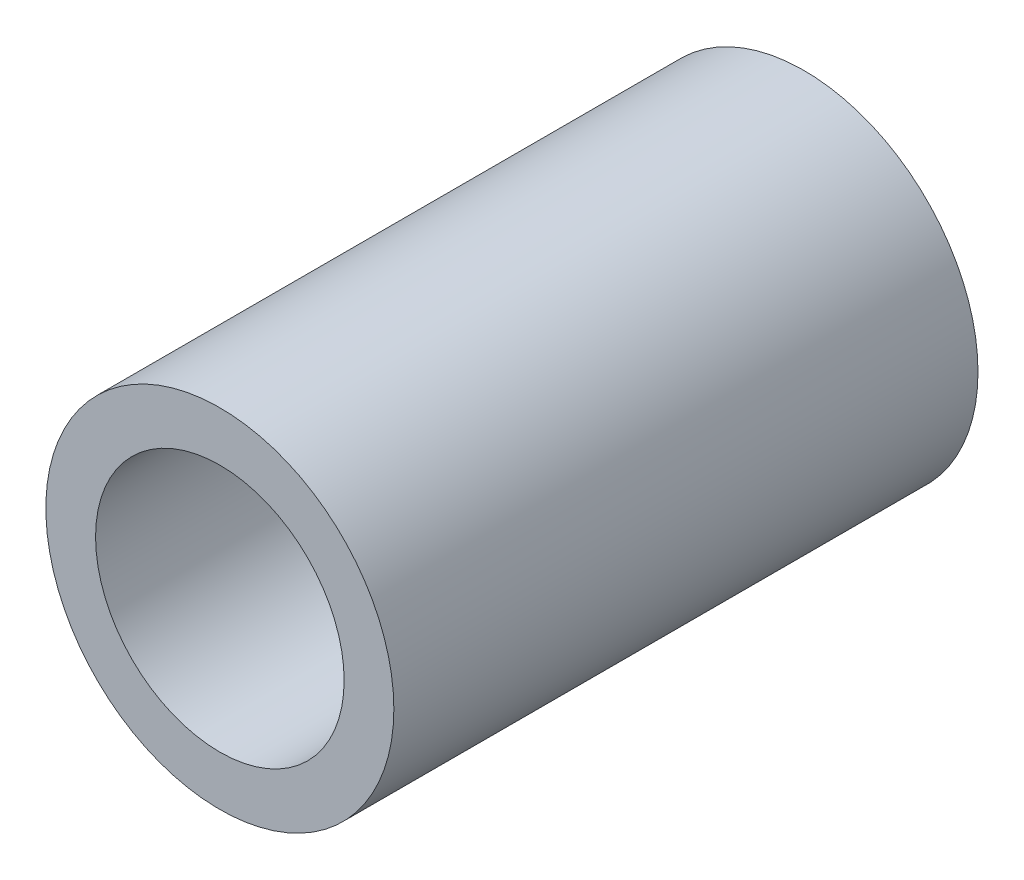
ISO-10303-21;
HEADER;
FILE_DESCRIPTION(('STEP AP214'),'2;1');
FILE_NAME('part.step','',(''),(''),'','','');
FILE_SCHEMA(('AUTOMOTIVE_DESIGN { 1 0 10303 214 1 1 1 1 }'));
ENDSEC;
DATA;
#1=APPLICATION_CONTEXT('core data for automotive mechanical design processes');
#2=APPLICATION_PROTOCOL_DEFINITION('international standard','automotive_design',2000,#1);
#3=PRODUCT_CONTEXT('',#1,'mechanical');
#4=PRODUCT('Part','Part','',(#3));
#5=PRODUCT_RELATED_PRODUCT_CATEGORY('part','',(#4));
#6=PRODUCT_DEFINITION_FORMATION('','',#4);
#7=PRODUCT_DEFINITION_CONTEXT('part definition',#1,'design');
#8=PRODUCT_DEFINITION('design','',#6,#7);
#9=PRODUCT_DEFINITION_SHAPE('','',#8);
#10=(LENGTH_UNIT() NAMED_UNIT(*) SI_UNIT(.MILLI.,.METRE.));
#11=(NAMED_UNIT(*) PLANE_ANGLE_UNIT() SI_UNIT($,.RADIAN.));
#12=(NAMED_UNIT(*) SI_UNIT($,.STERADIAN.) SOLID_ANGLE_UNIT());
#13=UNCERTAINTY_MEASURE_WITH_UNIT(LENGTH_MEASURE(1.E-05),#10,'distance_accuracy_value','');
#14=(GEOMETRIC_REPRESENTATION_CONTEXT(3) GLOBAL_UNCERTAINTY_ASSIGNED_CONTEXT((#13)) GLOBAL_UNIT_ASSIGNED_CONTEXT((#10,
#11,#12)) REPRESENTATION_CONTEXT('',''));
#15=CARTESIAN_POINT('',(0.,0.,0.));
#16=DIRECTION('',(0.,0.,1.));
#17=DIRECTION('',(1.,0.,0.));
#18=AXIS2_PLACEMENT_3D('',#15,#16,#17);
#19=CARTESIAN_POINT('',(0.,0.,23.5));
#20=DIRECTION('',(0.,0.,1.));
#21=DIRECTION('',(1.,0.,0.));
#22=AXIS2_PLACEMENT_3D('',#19,#20,#21);
#23=PLANE('',#22);
#24=CARTESIAN_POINT('',(0.,0.,23.5));
#25=DIRECTION('',(0.,0.,1.));
#26=DIRECTION('',(1.,0.,0.));
#27=AXIS2_PLACEMENT_3D('',#24,#25,#26);
#28=CIRCLE('',#27,7.);
#29=CARTESIAN_POINT('',(7.,0.,23.5));
#30=VERTEX_POINT('',#29);
#31=EDGE_CURVE('E10',#30,#30,#28,.T.);
#32=ORIENTED_EDGE('',*,*,#31,.T.);
#33=EDGE_LOOP('',(#32));
#34=FACE_BOUND('',#33,.T.);
#35=CARTESIAN_POINT('',(0.,0.,23.5));
#36=DIRECTION('',(0.,0.,1.));
#37=DIRECTION('',(1.,0.,0.));
#38=AXIS2_PLACEMENT_3D('',#35,#36,#37);
#39=CIRCLE('',#38,5.);
#40=CARTESIAN_POINT('',(5.,0.,23.5));
#41=VERTEX_POINT('',#40);
#42=EDGE_CURVE('E44',#41,#41,#39,.T.);
#43=ORIENTED_EDGE('',*,*,#42,.F.);
#44=EDGE_LOOP('',(#43));
#45=FACE_BOUND('',#44,.T.);
#46=ADVANCED_FACE('F33',(#34,#45),#23,.T.);
#47=CARTESIAN_POINT('',(0.,0.,0.));
#48=DIRECTION('',(0.,0.,1.));
#49=DIRECTION('',(1.,0.,0.));
#50=AXIS2_PLACEMENT_3D('',#47,#48,#49);
#51=PLANE('',#50);
#52=CARTESIAN_POINT('',(0.,0.,0.));
#53=DIRECTION('',(0.,0.,1.));
#54=DIRECTION('',(1.,0.,0.));
#55=AXIS2_PLACEMENT_3D('',#52,#53,#54);
#56=CIRCLE('',#55,7.);
#57=CARTESIAN_POINT('',(7.,0.,0.));
#58=VERTEX_POINT('',#57);
#59=EDGE_CURVE('E37',#58,#58,#56,.T.);
#60=ORIENTED_EDGE('',*,*,#59,.F.);
#61=EDGE_LOOP('',(#60));
#62=FACE_BOUND('',#61,.T.);
#63=CARTESIAN_POINT('',(0.,0.,0.));
#64=DIRECTION('',(0.,0.,1.));
#65=DIRECTION('',(1.,0.,0.));
#66=AXIS2_PLACEMENT_3D('',#63,#64,#65);
#67=CIRCLE('',#66,5.);
#68=CARTESIAN_POINT('',(5.,0.,0.));
#69=VERTEX_POINT('',#68);
#70=EDGE_CURVE('E46',#69,#69,#67,.T.);
#71=ORIENTED_EDGE('',*,*,#70,.T.);
#72=EDGE_LOOP('',(#71));
#73=FACE_BOUND('',#72,.T.);
#74=ADVANCED_FACE('F56',(#62,#73),#51,.F.);
#75=CARTESIAN_POINT('',(0.,0.,23.5));
#76=DIRECTION('',(0.,0.,-1.));
#77=DIRECTION('',(-1.,0.,0.));
#78=AXIS2_PLACEMENT_3D('',#75,#76,#77);
#79=CYLINDRICAL_SURFACE('',#78,7.);
#80=ORIENTED_EDGE('',*,*,#31,.F.);
#81=EDGE_LOOP('',(#80));
#82=FACE_BOUND('',#81,.T.);
#83=ORIENTED_EDGE('',*,*,#59,.T.);
#84=EDGE_LOOP('',(#83));
#85=FACE_BOUND('',#84,.T.);
#86=ADVANCED_FACE('F35',(#82,#85),#79,.T.);
#87=CARTESIAN_POINT('',(0.,0.,23.5));
#88=DIRECTION('',(0.,0.,-1.));
#89=DIRECTION('',(-1.,0.,0.));
#90=AXIS2_PLACEMENT_3D('',#87,#88,#89);
#91=CYLINDRICAL_SURFACE('',#90,5.);
#92=ORIENTED_EDGE('',*,*,#42,.T.);
#93=EDGE_LOOP('',(#92));
#94=FACE_BOUND('',#93,.T.);
#95=ORIENTED_EDGE('',*,*,#70,.F.);
#96=EDGE_LOOP('',(#95));
#97=FACE_BOUND('',#96,.T.);
#98=ADVANCED_FACE('F52',(#94,#97),#91,.F.);
#99=CLOSED_SHELL('',(#46,#74,#86,#98));
#100=MANIFOLD_SOLID_BREP('B2',#99);
#101=ADVANCED_BREP_SHAPE_REPRESENTATION('',(#18,#100),#14);
#102=SHAPE_DEFINITION_REPRESENTATION(#9,#101);
ENDSEC;
END-ISO-10303-21;
